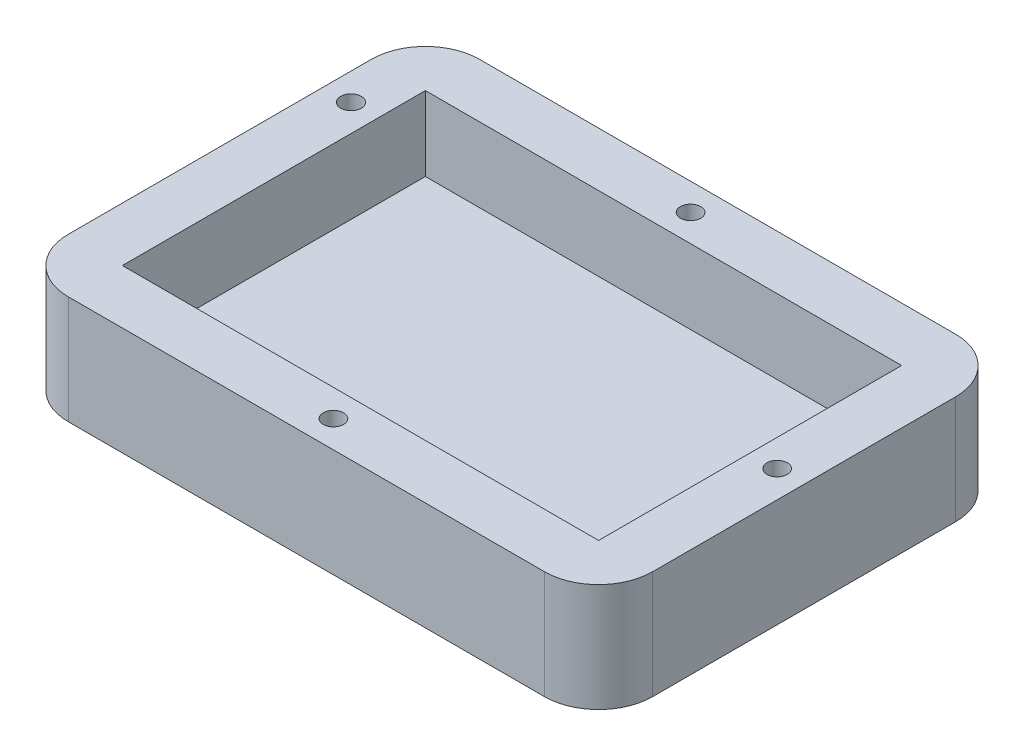
ISO-10303-21;
HEADER;
FILE_DESCRIPTION(('STEP AP214'),'2;1');
FILE_NAME('part.step','',(''),(''),'','','');
FILE_SCHEMA(('AUTOMOTIVE_DESIGN { 1 0 10303 214 1 1 1 1 }'));
ENDSEC;
DATA;
#1=APPLICATION_CONTEXT('core data for automotive mechanical design processes');
#2=APPLICATION_PROTOCOL_DEFINITION('international standard','automotive_design',2000,#1);
#3=PRODUCT_CONTEXT('',#1,'mechanical');
#4=PRODUCT('Part','Part','',(#3));
#5=PRODUCT_RELATED_PRODUCT_CATEGORY('part','',(#4));
#6=PRODUCT_DEFINITION_FORMATION('','',#4);
#7=PRODUCT_DEFINITION_CONTEXT('part definition',#1,'design');
#8=PRODUCT_DEFINITION('design','',#6,#7);
#9=PRODUCT_DEFINITION_SHAPE('','',#8);
#10=(LENGTH_UNIT() NAMED_UNIT(*) SI_UNIT(.MILLI.,.METRE.));
#11=(NAMED_UNIT(*) PLANE_ANGLE_UNIT() SI_UNIT($,.RADIAN.));
#12=(NAMED_UNIT(*) SI_UNIT($,.STERADIAN.) SOLID_ANGLE_UNIT());
#13=UNCERTAINTY_MEASURE_WITH_UNIT(LENGTH_MEASURE(1.E-05),#10,'distance_accuracy_value','');
#14=(GEOMETRIC_REPRESENTATION_CONTEXT(3) GLOBAL_UNCERTAINTY_ASSIGNED_CONTEXT((#13)) GLOBAL_UNIT_ASSIGNED_CONTEXT((#10,
#11,#12)) REPRESENTATION_CONTEXT('',''));
#15=CARTESIAN_POINT('',(0.,0.,0.));
#16=DIRECTION('',(0.,0.,1.));
#17=DIRECTION('',(1.,0.,0.));
#18=AXIS2_PLACEMENT_3D('',#15,#16,#17);
#19=CARTESIAN_POINT('',(-39.2,-15.,-15.4));
#20=DIRECTION('',(0.,1.,0.));
#21=DIRECTION('',(0.,0.,1.));
#22=AXIS2_PLACEMENT_3D('',#19,#20,#21);
#23=CYLINDRICAL_SURFACE('',#22,1.525);
#24=CARTESIAN_POINT('',(-39.2,1.,-15.4));
#25=DIRECTION('',(0.,1.,0.));
#26=DIRECTION('',(0.,0.,1.));
#27=AXIS2_PLACEMENT_3D('',#24,#25,#26);
#28=CIRCLE('',#27,1.525);
#29=CARTESIAN_POINT('',(-39.2,1.,-13.875));
#30=VERTEX_POINT('',#29);
#31=EDGE_CURVE('E657',#30,#30,#28,.T.);
#32=ORIENTED_EDGE('',*,*,#31,.T.);
#33=EDGE_LOOP('',(#32));
#34=FACE_BOUND('',#33,.T.);
#35=CARTESIAN_POINT('',(-39.2,-11.,-15.4));
#36=DIRECTION('',(0.,-1.,0.));
#37=DIRECTION('',(0.,0.,-1.));
#38=AXIS2_PLACEMENT_3D('',#35,#36,#37);
#39=CIRCLE('',#38,1.525);
#40=CARTESIAN_POINT('',(-39.2,-11.,-16.925));
#41=VERTEX_POINT('',#40);
#42=EDGE_CURVE('E45',#41,#41,#39,.F.);
#43=ORIENTED_EDGE('',*,*,#42,.F.);
#44=EDGE_LOOP('',(#43));
#45=FACE_BOUND('',#44,.T.);
#46=ADVANCED_FACE('F41',(#34,#45),#23,.F.);
#47=CARTESIAN_POINT('',(0.,-4.,-26.4));
#48=DIRECTION('',(0.,-1.,0.));
#49=DIRECTION('',(0.,0.,-1.));
#50=AXIS2_PLACEMENT_3D('',#47,#48,#49);
#51=CYLINDRICAL_SURFACE('',#50,1.5);
#52=CARTESIAN_POINT('',(0.,-11.,-26.4));
#53=DIRECTION('',(0.,-1.,0.));
#54=DIRECTION('',(0.,0.,-1.));
#55=AXIS2_PLACEMENT_3D('',#52,#53,#54);
#56=CIRCLE('',#55,1.5);
#57=CARTESIAN_POINT('',(0.,-11.,-27.9));
#58=VERTEX_POINT('',#57);
#59=EDGE_CURVE('E217',#58,#58,#56,.F.);
#60=ORIENTED_EDGE('',*,*,#59,.F.);
#61=EDGE_LOOP('',(#60));
#62=FACE_BOUND('',#61,.T.);
#63=CARTESIAN_POINT('',(0.,1.,-26.4));
#64=DIRECTION('',(0.,1.,0.));
#65=DIRECTION('',(0.,0.,1.));
#66=AXIS2_PLACEMENT_3D('',#63,#64,#65);
#67=CIRCLE('',#66,1.5);
#68=CARTESIAN_POINT('',(0.,1.,-24.9));
#69=VERTEX_POINT('',#68);
#70=EDGE_CURVE('E158',#69,#69,#67,.F.);
#71=ORIENTED_EDGE('',*,*,#70,.F.);
#72=EDGE_LOOP('',(#71));
#73=FACE_BOUND('',#72,.T.);
#74=ADVANCED_FACE('F302',(#62,#73),#51,.F.);
#75=CARTESIAN_POINT('',(39.2,-4.,0.));
#76=DIRECTION('',(0.,-1.,0.));
#77=DIRECTION('',(0.,0.,-1.));
#78=AXIS2_PLACEMENT_3D('',#75,#76,#77);
#79=CYLINDRICAL_SURFACE('',#78,1.5);
#80=CARTESIAN_POINT('',(39.2,-11.,0.));
#81=DIRECTION('',(0.,-1.,0.));
#82=DIRECTION('',(0.,0.,-1.));
#83=AXIS2_PLACEMENT_3D('',#80,#81,#82);
#84=CIRCLE('',#83,1.5);
#85=CARTESIAN_POINT('',(39.2,-11.,-1.50000000000001));
#86=VERTEX_POINT('',#85);
#87=EDGE_CURVE('E208',#86,#86,#84,.F.);
#88=ORIENTED_EDGE('',*,*,#87,.F.);
#89=EDGE_LOOP('',(#88));
#90=FACE_BOUND('',#89,.T.);
#91=CARTESIAN_POINT('',(39.2,1.,0.));
#92=DIRECTION('',(0.,1.,0.));
#93=DIRECTION('',(0.,0.,1.));
#94=AXIS2_PLACEMENT_3D('',#91,#92,#93);
#95=CIRCLE('',#94,1.5);
#96=CARTESIAN_POINT('',(39.2,1.,1.5));
#97=VERTEX_POINT('',#96);
#98=EDGE_CURVE('E161',#97,#97,#95,.F.);
#99=ORIENTED_EDGE('',*,*,#98,.F.);
#100=EDGE_LOOP('',(#99));
#101=FACE_BOUND('',#100,.T.);
#102=ADVANCED_FACE('F310',(#90,#101),#79,.F.);
#103=CARTESIAN_POINT('',(0.,-4.,26.4));
#104=DIRECTION('',(0.,-1.,0.));
#105=DIRECTION('',(0.,0.,-1.));
#106=AXIS2_PLACEMENT_3D('',#103,#104,#105);
#107=CYLINDRICAL_SURFACE('',#106,1.5);
#108=CARTESIAN_POINT('',(0.,-11.,26.4));
#109=DIRECTION('',(0.,-1.,0.));
#110=DIRECTION('',(0.,0.,-1.));
#111=AXIS2_PLACEMENT_3D('',#108,#109,#110);
#112=CIRCLE('',#111,1.5);
#113=CARTESIAN_POINT('',(0.,-11.,24.9));
#114=VERTEX_POINT('',#113);
#115=EDGE_CURVE('E195',#114,#114,#112,.F.);
#116=ORIENTED_EDGE('',*,*,#115,.F.);
#117=EDGE_LOOP('',(#116));
#118=FACE_BOUND('',#117,.T.);
#119=CARTESIAN_POINT('',(0.,1.,26.4));
#120=DIRECTION('',(0.,1.,0.));
#121=DIRECTION('',(0.,0.,1.));
#122=AXIS2_PLACEMENT_3D('',#119,#120,#121);
#123=CIRCLE('',#122,1.5);
#124=CARTESIAN_POINT('',(0.,1.,27.9));
#125=VERTEX_POINT('',#124);
#126=EDGE_CURVE('E191',#125,#125,#123,.F.);
#127=ORIENTED_EDGE('',*,*,#126,.F.);
#128=EDGE_LOOP('',(#127));
#129=FACE_BOUND('',#128,.T.);
#130=ADVANCED_FACE('F347',(#118,#129),#107,.F.);
#131=CARTESIAN_POINT('',(43.2,-10.,30.4));
#132=DIRECTION('',(0.,0.,-1.));
#133=DIRECTION('',(-1.,0.,0.));
#134=AXIS2_PLACEMENT_3D('',#131,#132,#133);
#135=PLANE('',#134);
#136=DIRECTION('',(-1.,0.,0.));
#137=VECTOR('',#136,1.);
#138=CARTESIAN_POINT('',(43.2,-15.,30.4));
#139=LINE('',#138,#137);
#140=CARTESIAN_POINT('',(35.2,-15.,30.4));
#141=VERTEX_POINT('',#140);
#142=CARTESIAN_POINT('',(-35.2,-15.,30.4));
#143=VERTEX_POINT('',#142);
#144=EDGE_CURVE('E224',#141,#143,#139,.T.);
#145=ORIENTED_EDGE('',*,*,#144,.F.);
#146=DIRECTION('',(0.,1.,0.));
#147=VECTOR('',#146,1.);
#148=CARTESIAN_POINT('',(35.2,-10.,30.4));
#149=LINE('',#148,#147);
#150=CARTESIAN_POINT('',(35.2,1.,30.4));
#151=VERTEX_POINT('',#150);
#152=EDGE_CURVE('E11',#141,#151,#149,.T.);
#153=ORIENTED_EDGE('',*,*,#152,.T.);
#154=DIRECTION('',(1.,0.,0.));
#155=VECTOR('',#154,1.);
#156=CARTESIAN_POINT('',(0.,1.,30.4));
#157=LINE('',#156,#155);
#158=CARTESIAN_POINT('',(-35.2,1.,30.4));
#159=VERTEX_POINT('',#158);
#160=EDGE_CURVE('E188',#159,#151,#157,.T.);
#161=ORIENTED_EDGE('',*,*,#160,.F.);
#162=DIRECTION('',(0.,1.,0.));
#163=VECTOR('',#162,1.);
#164=CARTESIAN_POINT('',(-35.2,-10.,30.4));
#165=LINE('',#164,#163);
#166=EDGE_CURVE('E50',#159,#143,#165,.F.);
#167=ORIENTED_EDGE('',*,*,#166,.T.);
#168=EDGE_LOOP('',(#145,#153,#161,#167));
#169=FACE_BOUND('',#168,.T.);
#170=ADVANCED_FACE('F265',(#169),#135,.F.);
#171=CARTESIAN_POINT('',(-43.2,-10.,30.4));
#172=DIRECTION('',(1.,0.,0.));
#173=DIRECTION('',(0.,0.,-1.));
#174=AXIS2_PLACEMENT_3D('',#171,#172,#173);
#175=PLANE('',#174);
#176=DIRECTION('',(0.,1.,0.));
#177=VECTOR('',#176,1.);
#178=CARTESIAN_POINT('',(-43.2,-10.,22.4));
#179=LINE('',#178,#177);
#180=CARTESIAN_POINT('',(-43.2,-15.,22.4));
#181=VERTEX_POINT('',#180);
#182=CARTESIAN_POINT('',(-43.2,1.,22.4));
#183=VERTEX_POINT('',#182);
#184=EDGE_CURVE('E259',#181,#183,#179,.T.);
#185=ORIENTED_EDGE('',*,*,#184,.T.);
#186=DIRECTION('',(0.,0.,1.));
#187=VECTOR('',#186,1.);
#188=CARTESIAN_POINT('',(-43.2,1.,0.));
#189=LINE('',#188,#187);
#190=CARTESIAN_POINT('',(-43.2,1.,-22.4));
#191=VERTEX_POINT('',#190);
#192=EDGE_CURVE('E182',#191,#183,#189,.T.);
#193=ORIENTED_EDGE('',*,*,#192,.F.);
#194=DIRECTION('',(0.,1.,0.));
#195=VECTOR('',#194,1.);
#196=CARTESIAN_POINT('',(-43.2,-10.,-22.4));
#197=LINE('',#196,#195);
#198=CARTESIAN_POINT('',(-43.2,-15.,-22.4));
#199=VERTEX_POINT('',#198);
#200=EDGE_CURVE('E57',#191,#199,#197,.F.);
#201=ORIENTED_EDGE('',*,*,#200,.T.);
#202=DIRECTION('',(0.,0.,-1.));
#203=VECTOR('',#202,1.);
#204=CARTESIAN_POINT('',(-43.2,-15.,30.4));
#205=LINE('',#204,#203);
#206=EDGE_CURVE('E226',#181,#199,#205,.T.);
#207=ORIENTED_EDGE('',*,*,#206,.F.);
#208=EDGE_LOOP('',(#185,#193,#201,#207));
#209=FACE_BOUND('',#208,.T.);
#210=ADVANCED_FACE('F272',(#209),#175,.F.);
#211=CARTESIAN_POINT('',(-43.2,-10.,-30.4));
#212=DIRECTION('',(0.,0.,1.));
#213=DIRECTION('',(1.,0.,0.));
#214=AXIS2_PLACEMENT_3D('',#211,#212,#213);
#215=PLANE('',#214);
#216=DIRECTION('',(0.,1.,0.));
#217=VECTOR('',#216,1.);
#218=CARTESIAN_POINT('',(-35.2,-10.,-30.4));
#219=LINE('',#218,#217);
#220=CARTESIAN_POINT('',(-35.2,-15.,-30.4));
#221=VERTEX_POINT('',#220);
#222=CARTESIAN_POINT('',(-35.2,1.,-30.4));
#223=VERTEX_POINT('',#222);
#224=EDGE_CURVE('E248',#221,#223,#219,.T.);
#225=ORIENTED_EDGE('',*,*,#224,.T.);
#226=DIRECTION('',(-1.,0.,0.));
#227=VECTOR('',#226,1.);
#228=CARTESIAN_POINT('',(0.,1.,-30.4));
#229=LINE('',#228,#227);
#230=CARTESIAN_POINT('',(35.1999999999999,1.,-30.4));
#231=VERTEX_POINT('',#230);
#232=EDGE_CURVE('E176',#231,#223,#229,.T.);
#233=ORIENTED_EDGE('',*,*,#232,.F.);
#234=DIRECTION('',(0.,1.,0.));
#235=VECTOR('',#234,1.);
#236=CARTESIAN_POINT('',(35.2,-10.,-30.4));
#237=LINE('',#236,#235);
#238=CARTESIAN_POINT('',(35.2,-15.,-30.4));
#239=VERTEX_POINT('',#238);
#240=EDGE_CURVE('E250',#231,#239,#237,.F.);
#241=ORIENTED_EDGE('',*,*,#240,.T.);
#242=DIRECTION('',(1.,0.,0.));
#243=VECTOR('',#242,1.);
#244=CARTESIAN_POINT('',(-43.2,-15.,-30.4));
#245=LINE('',#244,#243);
#246=EDGE_CURVE('E228',#221,#239,#245,.T.);
#247=ORIENTED_EDGE('',*,*,#246,.F.);
#248=EDGE_LOOP('',(#225,#233,#241,#247));
#249=FACE_BOUND('',#248,.T.);
#250=ADVANCED_FACE('F283',(#249),#215,.F.);
#251=CARTESIAN_POINT('',(43.2,-10.,-30.4));
#252=DIRECTION('',(-1.,0.,0.));
#253=DIRECTION('',(0.,0.,1.));
#254=AXIS2_PLACEMENT_3D('',#251,#252,#253);
#255=PLANE('',#254);
#256=DIRECTION('',(0.,0.,1.));
#257=VECTOR('',#256,1.);
#258=CARTESIAN_POINT('',(43.2,-15.,-30.4));
#259=LINE('',#258,#257);
#260=CARTESIAN_POINT('',(43.2,-15.,-22.4));
#261=VERTEX_POINT('',#260);
#262=CARTESIAN_POINT('',(43.2,-15.,22.4));
#263=VERTEX_POINT('',#262);
#264=EDGE_CURVE('E202',#261,#263,#259,.T.);
#265=ORIENTED_EDGE('',*,*,#264,.F.);
#266=DIRECTION('',(0.,1.,0.));
#267=VECTOR('',#266,1.);
#268=CARTESIAN_POINT('',(43.2,-10.,-22.4));
#269=LINE('',#268,#267);
#270=CARTESIAN_POINT('',(43.2,1.,-22.4));
#271=VERTEX_POINT('',#270);
#272=EDGE_CURVE('E246',#261,#271,#269,.T.);
#273=ORIENTED_EDGE('',*,*,#272,.T.);
#274=DIRECTION('',(0.,0.,-1.));
#275=VECTOR('',#274,1.);
#276=CARTESIAN_POINT('',(43.2,1.,0.));
#277=LINE('',#276,#275);
#278=CARTESIAN_POINT('',(43.2,1.,22.4));
#279=VERTEX_POINT('',#278);
#280=EDGE_CURVE('E170',#279,#271,#277,.T.);
#281=ORIENTED_EDGE('',*,*,#280,.F.);
#282=DIRECTION('',(0.,1.,0.));
#283=VECTOR('',#282,1.);
#284=CARTESIAN_POINT('',(43.2,-10.,22.4));
#285=LINE('',#284,#283);
#286=EDGE_CURVE('E244',#279,#263,#285,.F.);
#287=ORIENTED_EDGE('',*,*,#286,.T.);
#288=EDGE_LOOP('',(#265,#273,#281,#287));
#289=FACE_BOUND('',#288,.T.);
#290=ADVANCED_FACE('F292',(#289),#255,.F.);
#291=CARTESIAN_POINT('',(0.,-15.,0.));
#292=DIRECTION('',(0.,-1.,0.));
#293=DIRECTION('',(0.,0.,-1.));
#294=AXIS2_PLACEMENT_3D('',#291,#292,#293);
#295=PLANE('',#294);
#296=CARTESIAN_POINT('',(-39.2,-15.,-15.4));
#297=DIRECTION('',(0.,-1.,0.));
#298=DIRECTION('',(0.,0.,-1.));
#299=AXIS2_PLACEMENT_3D('',#296,#297,#298);
#300=CIRCLE('',#299,3.);
#301=CARTESIAN_POINT('',(-39.2,-15.,-18.4));
#302=VERTEX_POINT('',#301);
#303=EDGE_CURVE('E653',#302,#302,#300,.T.);
#304=ORIENTED_EDGE('',*,*,#303,.F.);
#305=EDGE_LOOP('',(#304));
#306=FACE_BOUND('',#305,.T.);
#307=CARTESIAN_POINT('',(0.,-15.,26.4));
#308=DIRECTION('',(0.,-1.,0.));
#309=DIRECTION('',(0.,0.,-1.));
#310=AXIS2_PLACEMENT_3D('',#307,#308,#309);
#311=CIRCLE('',#310,3.);
#312=CARTESIAN_POINT('',(0.,-15.,23.4));
#313=VERTEX_POINT('',#312);
#314=EDGE_CURVE('E199',#313,#313,#311,.T.);
#315=ORIENTED_EDGE('',*,*,#314,.F.);
#316=EDGE_LOOP('',(#315));
#317=FACE_BOUND('',#316,.T.);
#318=CARTESIAN_POINT('',(39.2,-15.,0.));
#319=DIRECTION('',(0.,-1.,0.));
#320=DIRECTION('',(0.,0.,-1.));
#321=AXIS2_PLACEMENT_3D('',#318,#319,#320);
#322=CIRCLE('',#321,2.99999999999999);
#323=CARTESIAN_POINT('',(39.2,-15.,-2.99999999999999));
#324=VERTEX_POINT('',#323);
#325=EDGE_CURVE('E205',#324,#324,#322,.T.);
#326=ORIENTED_EDGE('',*,*,#325,.F.);
#327=EDGE_LOOP('',(#326));
#328=FACE_BOUND('',#327,.T.);
#329=CARTESIAN_POINT('',(0.,-15.,-26.4));
#330=DIRECTION('',(0.,-1.,0.));
#331=DIRECTION('',(0.,0.,-1.));
#332=AXIS2_PLACEMENT_3D('',#329,#330,#331);
#333=CIRCLE('',#332,3.);
#334=CARTESIAN_POINT('',(0.,-15.,-29.4));
#335=VERTEX_POINT('',#334);
#336=EDGE_CURVE('E212',#335,#335,#333,.T.);
#337=ORIENTED_EDGE('',*,*,#336,.F.);
#338=EDGE_LOOP('',(#337));
#339=FACE_BOUND('',#338,.T.);
#340=ORIENTED_EDGE('',*,*,#246,.T.);
#341=CARTESIAN_POINT('',(35.2,-15.,-22.4));
#342=DIRECTION('',(0.,-1.,0.));
#343=DIRECTION('',(0.,0.,-1.));
#344=AXIS2_PLACEMENT_3D('',#341,#342,#343);
#345=CIRCLE('',#344,8.);
#346=EDGE_CURVE('E257',#239,#261,#345,.T.);
#347=ORIENTED_EDGE('',*,*,#346,.T.);
#348=ORIENTED_EDGE('',*,*,#264,.T.);
#349=CARTESIAN_POINT('',(35.2,-15.,22.4));
#350=DIRECTION('',(0.,-1.,0.));
#351=DIRECTION('',(0.,0.,-1.));
#352=AXIS2_PLACEMENT_3D('',#349,#350,#351);
#353=CIRCLE('',#352,8.);
#354=EDGE_CURVE('E253',#263,#141,#353,.T.);
#355=ORIENTED_EDGE('',*,*,#354,.T.);
#356=ORIENTED_EDGE('',*,*,#144,.T.);
#357=CARTESIAN_POINT('',(-35.2,-15.,22.4));
#358=DIRECTION('',(0.,-1.,0.));
#359=DIRECTION('',(0.,0.,-1.));
#360=AXIS2_PLACEMENT_3D('',#357,#358,#359);
#361=CIRCLE('',#360,8.);
#362=EDGE_CURVE('E64',#143,#181,#361,.T.);
#363=ORIENTED_EDGE('',*,*,#362,.T.);
#364=ORIENTED_EDGE('',*,*,#206,.T.);
#365=CARTESIAN_POINT('',(-35.2,-15.,-22.4));
#366=DIRECTION('',(0.,-1.,0.));
#367=DIRECTION('',(0.,0.,-1.));
#368=AXIS2_PLACEMENT_3D('',#365,#366,#367);
#369=CIRCLE('',#368,8.);
#370=EDGE_CURVE('E255',#199,#221,#369,.T.);
#371=ORIENTED_EDGE('',*,*,#370,.T.);
#372=EDGE_LOOP('',(#340,#347,#348,#355,#356,#363,#364,#371));
#373=FACE_BOUND('',#372,.T.);
#374=ADVANCED_FACE('F269',(#306,#317,#328,#339,#373),#295,.T.);
#375=CARTESIAN_POINT('',(0.,-11.,26.4));
#376=DIRECTION('',(0.,-1.,0.));
#377=DIRECTION('',(0.,0.,-1.));
#378=AXIS2_PLACEMENT_3D('',#375,#376,#377);
#379=CYLINDRICAL_SURFACE('',#378,3.);
#380=CARTESIAN_POINT('',(0.,-11.,26.4));
#381=DIRECTION('',(0.,-1.,0.));
#382=DIRECTION('',(0.,0.,-1.));
#383=AXIS2_PLACEMENT_3D('',#380,#381,#382);
#384=CIRCLE('',#383,3.);
#385=CARTESIAN_POINT('',(0.,-11.,23.4));
#386=VERTEX_POINT('',#385);
#387=EDGE_CURVE('E198',#386,#386,#384,.T.);
#388=ORIENTED_EDGE('',*,*,#387,.F.);
#389=EDGE_LOOP('',(#388));
#390=FACE_BOUND('',#389,.T.);
#391=ORIENTED_EDGE('',*,*,#314,.T.);
#392=EDGE_LOOP('',(#391));
#393=FACE_BOUND('',#392,.T.);
#394=ADVANCED_FACE('F327',(#390,#393),#379,.F.);
#395=CARTESIAN_POINT('',(0.,-11.,0.));
#396=DIRECTION('',(0.,-1.,0.));
#397=DIRECTION('',(0.,0.,-1.));
#398=AXIS2_PLACEMENT_3D('',#395,#396,#397);
#399=PLANE('',#398);
#400=ORIENTED_EDGE('',*,*,#115,.T.);
#401=EDGE_LOOP('',(#400));
#402=FACE_BOUND('',#401,.T.);
#403=ORIENTED_EDGE('',*,*,#387,.T.);
#404=EDGE_LOOP('',(#403));
#405=FACE_BOUND('',#404,.T.);
#406=ADVANCED_FACE('F323',(#402,#405),#399,.T.);
#407=CARTESIAN_POINT('',(39.2,-11.,0.));
#408=DIRECTION('',(0.,-1.,0.));
#409=DIRECTION('',(0.,0.,-1.));
#410=AXIS2_PLACEMENT_3D('',#407,#408,#409);
#411=CYLINDRICAL_SURFACE('',#410,2.99999999999999);
#412=CARTESIAN_POINT('',(39.2,-11.,0.));
#413=DIRECTION('',(0.,-1.,0.));
#414=DIRECTION('',(0.,0.,-1.));
#415=AXIS2_PLACEMENT_3D('',#412,#413,#414);
#416=CIRCLE('',#415,2.99999999999999);
#417=CARTESIAN_POINT('',(39.2,-11.,-2.99999999999999));
#418=VERTEX_POINT('',#417);
#419=EDGE_CURVE('E209',#418,#418,#416,.T.);
#420=ORIENTED_EDGE('',*,*,#419,.F.);
#421=EDGE_LOOP('',(#420));
#422=FACE_BOUND('',#421,.T.);
#423=ORIENTED_EDGE('',*,*,#325,.T.);
#424=EDGE_LOOP('',(#423));
#425=FACE_BOUND('',#424,.T.);
#426=ADVANCED_FACE('F326',(#422,#425),#411,.F.);
#427=CARTESIAN_POINT('',(0.,-11.,0.));
#428=DIRECTION('',(0.,-1.,0.));
#429=DIRECTION('',(0.,0.,-1.));
#430=AXIS2_PLACEMENT_3D('',#427,#428,#429);
#431=PLANE('',#430);
#432=ORIENTED_EDGE('',*,*,#87,.T.);
#433=EDGE_LOOP('',(#432));
#434=FACE_BOUND('',#433,.T.);
#435=ORIENTED_EDGE('',*,*,#419,.T.);
#436=EDGE_LOOP('',(#435));
#437=FACE_BOUND('',#436,.T.);
#438=ADVANCED_FACE('F334',(#434,#437),#431,.T.);
#439=CARTESIAN_POINT('',(0.,-11.,-26.4));
#440=DIRECTION('',(0.,-1.,0.));
#441=DIRECTION('',(0.,0.,-1.));
#442=AXIS2_PLACEMENT_3D('',#439,#440,#441);
#443=CYLINDRICAL_SURFACE('',#442,3.);
#444=CARTESIAN_POINT('',(0.,-11.,-26.4));
#445=DIRECTION('',(0.,-1.,0.));
#446=DIRECTION('',(0.,0.,-1.));
#447=AXIS2_PLACEMENT_3D('',#444,#445,#446);
#448=CIRCLE('',#447,3.);
#449=CARTESIAN_POINT('',(0.,-11.,-29.4));
#450=VERTEX_POINT('',#449);
#451=EDGE_CURVE('E194',#450,#450,#448,.T.);
#452=ORIENTED_EDGE('',*,*,#451,.F.);
#453=EDGE_LOOP('',(#452));
#454=FACE_BOUND('',#453,.T.);
#455=ORIENTED_EDGE('',*,*,#336,.T.);
#456=EDGE_LOOP('',(#455));
#457=FACE_BOUND('',#456,.T.);
#458=ADVANCED_FACE('F338',(#454,#457),#443,.F.);
#459=CARTESIAN_POINT('',(0.,-11.,0.));
#460=DIRECTION('',(0.,-1.,0.));
#461=DIRECTION('',(0.,0.,-1.));
#462=AXIS2_PLACEMENT_3D('',#459,#460,#461);
#463=PLANE('',#462);
#464=ORIENTED_EDGE('',*,*,#59,.T.);
#465=EDGE_LOOP('',(#464));
#466=FACE_BOUND('',#465,.T.);
#467=ORIENTED_EDGE('',*,*,#451,.T.);
#468=EDGE_LOOP('',(#467));
#469=FACE_BOUND('',#468,.T.);
#470=ADVANCED_FACE('F342',(#466,#469),#463,.T.);
#471=CARTESIAN_POINT('',(35.2,-10.,-22.4));
#472=DIRECTION('',(0.,1.,0.));
#473=DIRECTION('',(0.,0.,1.));
#474=AXIS2_PLACEMENT_3D('',#471,#472,#473);
#475=CYLINDRICAL_SURFACE('',#474,8.);
#476=ORIENTED_EDGE('',*,*,#346,.F.);
#477=ORIENTED_EDGE('',*,*,#240,.F.);
#478=CARTESIAN_POINT('',(35.2,1.,-22.4));
#479=DIRECTION('',(0.,1.,0.));
#480=DIRECTION('',(0.,0.,1.));
#481=AXIS2_PLACEMENT_3D('',#478,#479,#480);
#482=CIRCLE('',#481,8.);
#483=EDGE_CURVE('E173',#271,#231,#482,.T.);
#484=ORIENTED_EDGE('',*,*,#483,.F.);
#485=ORIENTED_EDGE('',*,*,#272,.F.);
#486=EDGE_LOOP('',(#476,#477,#484,#485));
#487=FACE_BOUND('',#486,.T.);
#488=ADVANCED_FACE('F286',(#487),#475,.T.);
#489=CARTESIAN_POINT('',(-35.2,-10.,-22.4));
#490=DIRECTION('',(0.,1.,0.));
#491=DIRECTION('',(0.,0.,1.));
#492=AXIS2_PLACEMENT_3D('',#489,#490,#491);
#493=CYLINDRICAL_SURFACE('',#492,8.);
#494=ORIENTED_EDGE('',*,*,#370,.F.);
#495=ORIENTED_EDGE('',*,*,#200,.F.);
#496=CARTESIAN_POINT('',(-35.2,1.,-22.4));
#497=DIRECTION('',(0.,1.,0.));
#498=DIRECTION('',(0.,0.,1.));
#499=AXIS2_PLACEMENT_3D('',#496,#497,#498);
#500=CIRCLE('',#499,8.);
#501=EDGE_CURVE('E179',#223,#191,#500,.T.);
#502=ORIENTED_EDGE('',*,*,#501,.F.);
#503=ORIENTED_EDGE('',*,*,#224,.F.);
#504=EDGE_LOOP('',(#494,#495,#502,#503));
#505=FACE_BOUND('',#504,.T.);
#506=ADVANCED_FACE('F279',(#505),#493,.T.);
#507=CARTESIAN_POINT('',(35.2,-10.,22.4));
#508=DIRECTION('',(0.,1.,0.));
#509=DIRECTION('',(0.,0.,1.));
#510=AXIS2_PLACEMENT_3D('',#507,#508,#509);
#511=CYLINDRICAL_SURFACE('',#510,8.);
#512=ORIENTED_EDGE('',*,*,#354,.F.);
#513=ORIENTED_EDGE('',*,*,#286,.F.);
#514=CARTESIAN_POINT('',(35.2,1.,22.4));
#515=DIRECTION('',(0.,1.,0.));
#516=DIRECTION('',(0.,0.,1.));
#517=AXIS2_PLACEMENT_3D('',#514,#515,#516);
#518=CIRCLE('',#517,8.);
#519=EDGE_CURVE('E167',#151,#279,#518,.T.);
#520=ORIENTED_EDGE('',*,*,#519,.F.);
#521=ORIENTED_EDGE('',*,*,#152,.F.);
#522=EDGE_LOOP('',(#512,#513,#520,#521));
#523=FACE_BOUND('',#522,.T.);
#524=ADVANCED_FACE('F294',(#523),#511,.T.);
#525=CARTESIAN_POINT('',(-35.2,-10.,22.4));
#526=DIRECTION('',(0.,1.,0.));
#527=DIRECTION('',(0.,0.,1.));
#528=AXIS2_PLACEMENT_3D('',#525,#526,#527);
#529=CYLINDRICAL_SURFACE('',#528,8.);
#530=ORIENTED_EDGE('',*,*,#362,.F.);
#531=ORIENTED_EDGE('',*,*,#166,.F.);
#532=CARTESIAN_POINT('',(-35.2,1.,22.4));
#533=DIRECTION('',(0.,1.,0.));
#534=DIRECTION('',(0.,0.,1.));
#535=AXIS2_PLACEMENT_3D('',#532,#533,#534);
#536=CIRCLE('',#535,8.);
#537=EDGE_CURVE('E185',#183,#159,#536,.T.);
#538=ORIENTED_EDGE('',*,*,#537,.F.);
#539=ORIENTED_EDGE('',*,*,#184,.F.);
#540=EDGE_LOOP('',(#530,#531,#538,#539));
#541=FACE_BOUND('',#540,.T.);
#542=ADVANCED_FACE('F43',(#541),#529,.T.);
#543=CARTESIAN_POINT('',(0.,1.,0.));
#544=DIRECTION('',(0.,1.,0.));
#545=DIRECTION('',(0.,0.,1.));
#546=AXIS2_PLACEMENT_3D('',#543,#544,#545);
#547=PLANE('',#546);
#548=ORIENTED_EDGE('',*,*,#31,.F.);
#549=EDGE_LOOP('',(#548));
#550=FACE_BOUND('',#549,.T.);
#551=ORIENTED_EDGE('',*,*,#98,.T.);
#552=EDGE_LOOP('',(#551));
#553=FACE_BOUND('',#552,.T.);
#554=ORIENTED_EDGE('',*,*,#70,.T.);
#555=EDGE_LOOP('',(#554));
#556=FACE_BOUND('',#555,.T.);
#557=DIRECTION('',(0.,0.,1.));
#558=VECTOR('',#557,1.);
#559=CARTESIAN_POINT('',(35.2,1.,0.));
#560=LINE('',#559,#558);
#561=CARTESIAN_POINT('',(35.2,1.,-22.4));
#562=VERTEX_POINT('',#561);
#563=CARTESIAN_POINT('',(35.2,1.,22.4));
#564=VERTEX_POINT('',#563);
#565=EDGE_CURVE('E137',#562,#564,#560,.T.);
#566=ORIENTED_EDGE('',*,*,#565,.T.);
#567=DIRECTION('',(-1.,0.,0.));
#568=VECTOR('',#567,1.);
#569=CARTESIAN_POINT('',(0.,1.,22.4));
#570=LINE('',#569,#568);
#571=CARTESIAN_POINT('',(-35.2,1.,22.4));
#572=VERTEX_POINT('',#571);
#573=EDGE_CURVE('E144',#564,#572,#570,.T.);
#574=ORIENTED_EDGE('',*,*,#573,.T.);
#575=DIRECTION('',(0.,0.,-1.));
#576=VECTOR('',#575,1.);
#577=CARTESIAN_POINT('',(-35.2,1.,0.));
#578=LINE('',#577,#576);
#579=CARTESIAN_POINT('',(-35.2,1.,-22.4));
#580=VERTEX_POINT('',#579);
#581=EDGE_CURVE('E151',#572,#580,#578,.T.);
#582=ORIENTED_EDGE('',*,*,#581,.T.);
#583=DIRECTION('',(1.,0.,0.));
#584=VECTOR('',#583,1.);
#585=CARTESIAN_POINT('',(0.,1.,-22.4));
#586=LINE('',#585,#584);
#587=EDGE_CURVE('E157',#580,#562,#586,.T.);
#588=ORIENTED_EDGE('',*,*,#587,.T.);
#589=EDGE_LOOP('',(#566,#574,#582,#588));
#590=FACE_BOUND('',#589,.T.);
#591=ORIENTED_EDGE('',*,*,#519,.T.);
#592=ORIENTED_EDGE('',*,*,#280,.T.);
#593=ORIENTED_EDGE('',*,*,#483,.T.);
#594=ORIENTED_EDGE('',*,*,#232,.T.);
#595=ORIENTED_EDGE('',*,*,#501,.T.);
#596=ORIENTED_EDGE('',*,*,#192,.T.);
#597=ORIENTED_EDGE('',*,*,#537,.T.);
#598=ORIENTED_EDGE('',*,*,#160,.T.);
#599=EDGE_LOOP('',(#591,#592,#593,#594,#595,#596,#597,#598));
#600=FACE_BOUND('',#599,.T.);
#601=ORIENTED_EDGE('',*,*,#126,.T.);
#602=EDGE_LOOP('',(#601));
#603=FACE_BOUND('',#602,.T.);
#604=ADVANCED_FACE('F154',(#550,#553,#556,#590,#600,#603),#547,.T.);
#605=CARTESIAN_POINT('',(0.,-10.,0.));
#606=DIRECTION('',(0.,-1.,0.));
#607=DIRECTION('',(0.,0.,-1.));
#608=AXIS2_PLACEMENT_3D('',#605,#606,#607);
#609=PLANE('',#608);
#610=DIRECTION('',(0.,0.,-1.));
#611=VECTOR('',#610,1.);
#612=CARTESIAN_POINT('',(-35.2,-10.,-22.4));
#613=LINE('',#612,#611);
#614=CARTESIAN_POINT('',(-35.2,-10.,22.4));
#615=VERTEX_POINT('',#614);
#616=CARTESIAN_POINT('',(-35.2,-10.,-22.4));
#617=VERTEX_POINT('',#616);
#618=EDGE_CURVE('E233',#615,#617,#613,.T.);
#619=ORIENTED_EDGE('',*,*,#618,.F.);
#620=DIRECTION('',(-1.,0.,0.));
#621=VECTOR('',#620,1.);
#622=CARTESIAN_POINT('',(-35.2,-10.,22.4));
#623=LINE('',#622,#621);
#624=CARTESIAN_POINT('',(35.2,-10.,22.4));
#625=VERTEX_POINT('',#624);
#626=EDGE_CURVE('E231',#625,#615,#623,.T.);
#627=ORIENTED_EDGE('',*,*,#626,.F.);
#628=DIRECTION('',(0.,0.,1.));
#629=VECTOR('',#628,1.);
#630=CARTESIAN_POINT('',(35.2,-10.,22.4));
#631=LINE('',#630,#629);
#632=CARTESIAN_POINT('',(35.2,-10.,-22.4));
#633=VERTEX_POINT('',#632);
#634=EDGE_CURVE('E138',#633,#625,#631,.T.);
#635=ORIENTED_EDGE('',*,*,#634,.F.);
#636=DIRECTION('',(1.,0.,0.));
#637=VECTOR('',#636,1.);
#638=CARTESIAN_POINT('',(35.2,-10.,-22.4));
#639=LINE('',#638,#637);
#640=EDGE_CURVE('E236',#617,#633,#639,.T.);
#641=ORIENTED_EDGE('',*,*,#640,.F.);
#642=EDGE_LOOP('',(#619,#627,#635,#641));
#643=FACE_BOUND('',#642,.T.);
#644=ADVANCED_FACE('F321',(#643),#609,.F.);
#645=CARTESIAN_POINT('',(35.2,-10.,22.4));
#646=DIRECTION('',(-1.,0.,0.));
#647=DIRECTION('',(0.,0.,1.));
#648=AXIS2_PLACEMENT_3D('',#645,#646,#647);
#649=PLANE('',#648);
#650=DIRECTION('',(0.,1.,0.));
#651=VECTOR('',#650,1.);
#652=CARTESIAN_POINT('',(35.2,-10.,22.4));
#653=LINE('',#652,#651);
#654=EDGE_CURVE('E132',#625,#564,#653,.T.);
#655=ORIENTED_EDGE('',*,*,#654,.T.);
#656=ORIENTED_EDGE('',*,*,#565,.F.);
#657=DIRECTION('',(0.,1.,0.));
#658=VECTOR('',#657,1.);
#659=CARTESIAN_POINT('',(35.2,-10.,-22.4));
#660=LINE('',#659,#658);
#661=EDGE_CURVE('E141',#633,#562,#660,.T.);
#662=ORIENTED_EDGE('',*,*,#661,.F.);
#663=ORIENTED_EDGE('',*,*,#634,.T.);
#664=EDGE_LOOP('',(#655,#656,#662,#663));
#665=FACE_BOUND('',#664,.T.);
#666=ADVANCED_FACE('F134',(#665),#649,.T.);
#667=CARTESIAN_POINT('',(35.2,-10.,-22.4));
#668=DIRECTION('',(0.,0.,1.));
#669=DIRECTION('',(1.,0.,0.));
#670=AXIS2_PLACEMENT_3D('',#667,#668,#669);
#671=PLANE('',#670);
#672=ORIENTED_EDGE('',*,*,#661,.T.);
#673=ORIENTED_EDGE('',*,*,#587,.F.);
#674=DIRECTION('',(0.,1.,0.));
#675=VECTOR('',#674,1.);
#676=CARTESIAN_POINT('',(-35.2,-10.,-22.4));
#677=LINE('',#676,#675);
#678=EDGE_CURVE('E241',#617,#580,#677,.T.);
#679=ORIENTED_EDGE('',*,*,#678,.F.);
#680=ORIENTED_EDGE('',*,*,#640,.T.);
#681=EDGE_LOOP('',(#672,#673,#679,#680));
#682=FACE_BOUND('',#681,.T.);
#683=ADVANCED_FACE('F362',(#682),#671,.T.);
#684=CARTESIAN_POINT('',(-35.2,-10.,-22.4));
#685=DIRECTION('',(1.,0.,0.));
#686=DIRECTION('',(0.,0.,-1.));
#687=AXIS2_PLACEMENT_3D('',#684,#685,#686);
#688=PLANE('',#687);
#689=ORIENTED_EDGE('',*,*,#678,.T.);
#690=ORIENTED_EDGE('',*,*,#581,.F.);
#691=DIRECTION('',(0.,1.,0.));
#692=VECTOR('',#691,1.);
#693=CARTESIAN_POINT('',(-35.2,-10.,22.4));
#694=LINE('',#693,#692);
#695=EDGE_CURVE('E147',#615,#572,#694,.T.);
#696=ORIENTED_EDGE('',*,*,#695,.F.);
#697=ORIENTED_EDGE('',*,*,#618,.T.);
#698=EDGE_LOOP('',(#689,#690,#696,#697));
#699=FACE_BOUND('',#698,.T.);
#700=ADVANCED_FACE('F365',(#699),#688,.T.);
#701=CARTESIAN_POINT('',(-35.2,-10.,22.4));
#702=DIRECTION('',(0.,0.,-1.));
#703=DIRECTION('',(-1.,0.,0.));
#704=AXIS2_PLACEMENT_3D('',#701,#702,#703);
#705=PLANE('',#704);
#706=ORIENTED_EDGE('',*,*,#695,.T.);
#707=ORIENTED_EDGE('',*,*,#573,.F.);
#708=ORIENTED_EDGE('',*,*,#654,.F.);
#709=ORIENTED_EDGE('',*,*,#626,.T.);
#710=EDGE_LOOP('',(#706,#707,#708,#709));
#711=FACE_BOUND('',#710,.T.);
#712=ADVANCED_FACE('F145',(#711),#705,.T.);
#713=CARTESIAN_POINT('',(0.,-11.,0.));
#714=DIRECTION('',(0.,-1.,0.));
#715=DIRECTION('',(0.,0.,-1.));
#716=AXIS2_PLACEMENT_3D('',#713,#714,#715);
#717=PLANE('',#716);
#718=CARTESIAN_POINT('',(-39.2,-11.,-15.4));
#719=DIRECTION('',(0.,-1.,0.));
#720=DIRECTION('',(0.,0.,-1.));
#721=AXIS2_PLACEMENT_3D('',#718,#719,#720);
#722=CIRCLE('',#721,3.);
#723=CARTESIAN_POINT('',(-39.2,-11.,-18.4));
#724=VERTEX_POINT('',#723);
#725=EDGE_CURVE('E650',#724,#724,#722,.F.);
#726=ORIENTED_EDGE('',*,*,#725,.F.);
#727=EDGE_LOOP('',(#726));
#728=FACE_BOUND('',#727,.T.);
#729=ORIENTED_EDGE('',*,*,#42,.T.);
#730=EDGE_LOOP('',(#729));
#731=FACE_BOUND('',#730,.T.);
#732=ADVANCED_FACE('F371',(#728,#731),#717,.T.);
#733=CARTESIAN_POINT('',(-39.2,-2.51471862576142,-15.4));
#734=DIRECTION('',(0.,-1.,0.));
#735=DIRECTION('',(0.,0.,-1.));
#736=AXIS2_PLACEMENT_3D('',#733,#734,#735);
#737=CYLINDRICAL_SURFACE('',#736,3.);
#738=ORIENTED_EDGE('',*,*,#725,.T.);
#739=EDGE_LOOP('',(#738));
#740=FACE_BOUND('',#739,.T.);
#741=ORIENTED_EDGE('',*,*,#303,.T.);
#742=EDGE_LOOP('',(#741));
#743=FACE_BOUND('',#742,.T.);
#744=ADVANCED_FACE('F317',(#740,#743),#737,.F.);
#745=CLOSED_SHELL('',(#46,#74,#102,#130,#170,#210,#250,#290,#374,#394,#406,#426,#438,#458,#470,
#488,#506,#524,#542,#604,#644,#666,#683,#700,#712,#732,#744));
#746=MANIFOLD_SOLID_BREP('B2',#745);
#747=ADVANCED_BREP_SHAPE_REPRESENTATION('',(#18,#746),#14);
#748=SHAPE_DEFINITION_REPRESENTATION(#9,#747);
ENDSEC;
END-ISO-10303-21;
